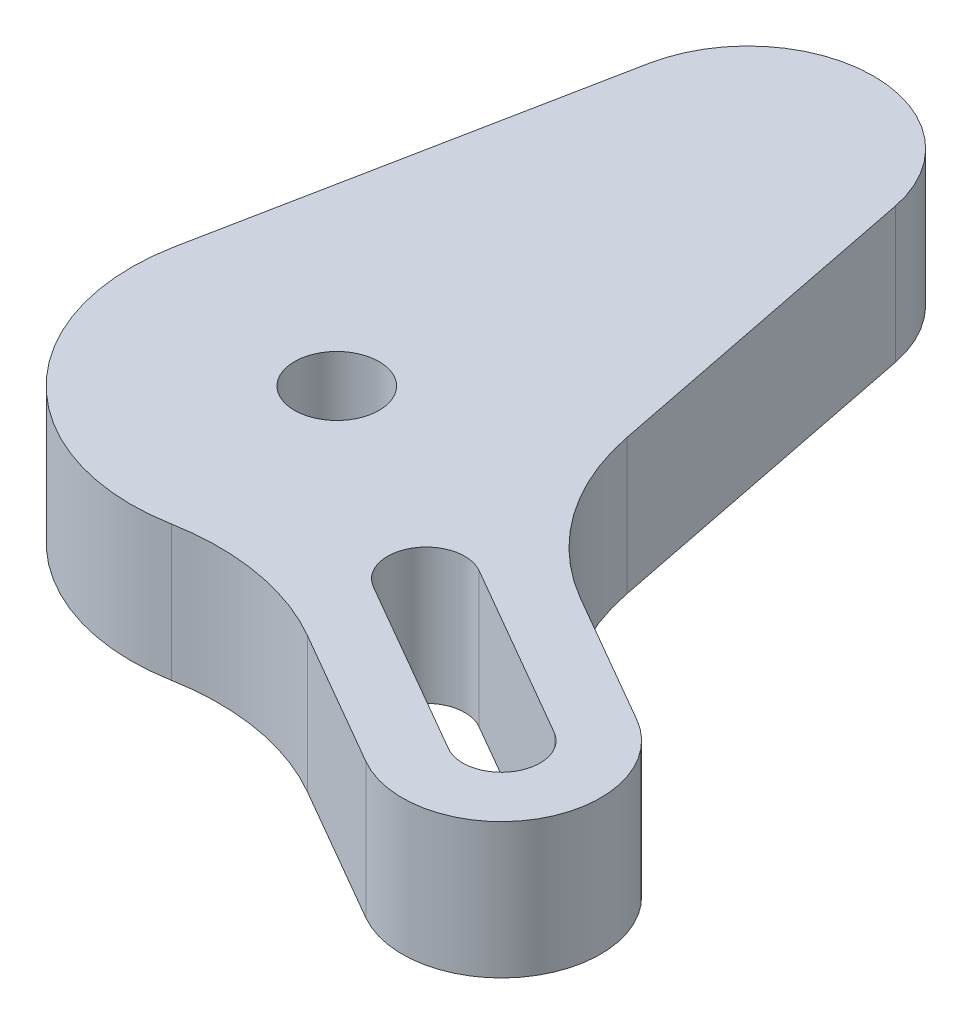
ISO-10303-21;
HEADER;
FILE_DESCRIPTION(('STEP AP214'),'2;1');
FILE_NAME('part.step','',(''),(''),'','','');
FILE_SCHEMA(('AUTOMOTIVE_DESIGN { 1 0 10303 214 1 1 1 1 }'));
ENDSEC;
DATA;
#1=APPLICATION_CONTEXT('core data for automotive mechanical design processes');
#2=APPLICATION_PROTOCOL_DEFINITION('international standard','automotive_design',2000,#1);
#3=PRODUCT_CONTEXT('',#1,'mechanical');
#4=PRODUCT('Part','Part','',(#3));
#5=PRODUCT_RELATED_PRODUCT_CATEGORY('part','',(#4));
#6=PRODUCT_DEFINITION_FORMATION('','',#4);
#7=PRODUCT_DEFINITION_CONTEXT('part definition',#1,'design');
#8=PRODUCT_DEFINITION('design','',#6,#7);
#9=PRODUCT_DEFINITION_SHAPE('','',#8);
#10=(LENGTH_UNIT() NAMED_UNIT(*) SI_UNIT(.MILLI.,.METRE.));
#11=(NAMED_UNIT(*) PLANE_ANGLE_UNIT() SI_UNIT($,.RADIAN.));
#12=(NAMED_UNIT(*) SI_UNIT($,.STERADIAN.) SOLID_ANGLE_UNIT());
#13=UNCERTAINTY_MEASURE_WITH_UNIT(LENGTH_MEASURE(1.E-05),#10,'distance_accuracy_value','');
#14=(GEOMETRIC_REPRESENTATION_CONTEXT(3) GLOBAL_UNCERTAINTY_ASSIGNED_CONTEXT((#13)) GLOBAL_UNIT_ASSIGNED_CONTEXT((#10,
#11,#12)) REPRESENTATION_CONTEXT('',''));
#15=CARTESIAN_POINT('',(0.,0.,0.));
#16=DIRECTION('',(0.,0.,1.));
#17=DIRECTION('',(1.,0.,0.));
#18=AXIS2_PLACEMENT_3D('',#15,#16,#17);
#19=CARTESIAN_POINT('',(0.,0.,-17.));
#20=DIRECTION('',(0.,1.,0.));
#21=DIRECTION('',(0.,0.,1.));
#22=AXIS2_PLACEMENT_3D('',#19,#20,#21);
#23=PLANE('',#22);
#24=CARTESIAN_POINT('',(0.,0.,0.));
#25=DIRECTION('',(0.,1.,0.));
#26=DIRECTION('',(0.,0.,1.));
#27=AXIS2_PLACEMENT_3D('',#24,#25,#26);
#28=CIRCLE('',#27,6.);
#29=CARTESIAN_POINT('',(-5.88586953708732,0.,-1.16470588235294));
#30=VERTEX_POINT('',#29);
#31=CARTESIAN_POINT('',(5.88586953708732,0.,-1.16470588235294));
#32=VERTEX_POINT('',#31);
#33=EDGE_CURVE('E292',#30,#32,#28,.T.);
#34=ORIENTED_EDGE('',*,*,#33,.T.);
#35=DIRECTION('',(0.194117647058824,0.,0.980978256181219));
#36=VECTOR('',#35,1.);
#37=CARTESIAN_POINT('',(5.88586953708732,0.,-1.16470588235294));
#38=LINE('',#37,#36);
#39=CARTESIAN_POINT('',(2.64864129168929,0.,-17.5241176470588));
#40=VERTEX_POINT('',#39);
#41=EDGE_CURVE('E279',#40,#32,#38,.T.);
#42=ORIENTED_EDGE('',*,*,#41,.F.);
#43=CARTESIAN_POINT('',(0.,0.,-17.));
#44=DIRECTION('',(0.,1.,0.));
#45=DIRECTION('',(0.,0.,1.));
#46=AXIS2_PLACEMENT_3D('',#43,#44,#45);
#47=CIRCLE('',#46,2.7);
#48=CARTESIAN_POINT('',(-2.64864129168929,0.,-17.5241176470588));
#49=VERTEX_POINT('',#48);
#50=EDGE_CURVE('E275',#40,#49,#47,.T.);
#51=ORIENTED_EDGE('',*,*,#50,.T.);
#52=DIRECTION('',(-0.194117647058824,0.,0.980978256181219));
#53=VECTOR('',#52,1.);
#54=CARTESIAN_POINT('',(-5.88586953708732,0.,-1.16470588235294));
#55=LINE('',#54,#53);
#56=EDGE_CURVE('E289',#49,#30,#55,.T.);
#57=ORIENTED_EDGE('',*,*,#56,.T.);
#58=EDGE_LOOP('',(#34,#42,#51,#57));
#59=FACE_BOUND('',#58,.T.);
#60=DIRECTION('',(0.194117647058824,0.,0.980978256181219));
#61=VECTOR('',#60,1.);
#62=CARTESIAN_POINT('',(8.33831517754037,0.,-1.65));
#63=LINE('',#62,#61);
#64=CARTESIAN_POINT('',(5.10108693214234,0.,-18.0094117647059));
#65=VERTEX_POINT('',#64);
#66=CARTESIAN_POINT('',(7.8440779192227,0.,-4.14764001959767));
#67=VERTEX_POINT('',#66);
#68=EDGE_CURVE('E314',#65,#67,#63,.T.);
#69=ORIENTED_EDGE('',*,*,#68,.T.);
#70=CARTESIAN_POINT('',(17.6538604810349,0.,-6.0888164901859));
#71=DIRECTION('',(0.,1.,0.));
#72=DIRECTION('',(0.,0.,1.));
#73=AXIS2_PLACEMENT_3D('',#70,#71,#72);
#74=CIRCLE('',#73,10.);
#75=CARTESIAN_POINT('',(12.6538604810349,0.,2.5714375476585));
#76=VERTEX_POINT('',#75);
#77=EDGE_CURVE('E89',#67,#76,#74,.T.);
#78=ORIENTED_EDGE('',*,*,#77,.T.);
#79=DIRECTION('',(-0.86602540378444,0.,-0.499999999999998));
#80=VECTOR('',#79,1.);
#81=CARTESIAN_POINT('',(18.1580725103906,0.,5.74929584448375));
#82=LINE('',#81,#80);
#83=CARTESIAN_POINT('',(18.1580725103906,0.,5.74929584448375));
#84=VERTEX_POINT('',#83);
#85=EDGE_CURVE('E248',#84,#76,#82,.T.);
#86=ORIENTED_EDGE('',*,*,#85,.F.);
#87=CARTESIAN_POINT('',(16.1080725103906,0.,9.29999999999995));
#88=DIRECTION('',(0.,1.,0.));
#89=DIRECTION('',(1.,0.,0.));
#90=AXIS2_PLACEMENT_3D('',#87,#88,#89);
#91=CIRCLE('',#90,4.1);
#92=CARTESIAN_POINT('',(14.0580725103906,0.,12.8507041555162));
#93=VERTEX_POINT('',#92);
#94=EDGE_CURVE('E245',#93,#84,#91,.T.);
#95=ORIENTED_EDGE('',*,*,#94,.F.);
#96=DIRECTION('',(-0.86602540378444,0.,-0.499999999999998));
#97=VECTOR('',#96,1.);
#98=CARTESIAN_POINT('',(14.0580725103906,0.,12.8507041555162));
#99=LINE('',#98,#97);
#100=CARTESIAN_POINT('',(8.32207790175145,0.,9.53902612414812));
#101=VERTEX_POINT('',#100);
#102=EDGE_CURVE('E251',#93,#101,#99,.T.);
#103=ORIENTED_EDGE('',*,*,#102,.T.);
#104=CARTESIAN_POINT('',(3.32207790175147,0.,18.1992801619925));
#105=DIRECTION('',(0.,1.,0.));
#106=DIRECTION('',(0.,0.,1.));
#107=AXIS2_PLACEMENT_3D('',#104,#105,#106);
#108=CIRCLE('',#107,10.);
#109=CARTESIAN_POINT('',(1.52636011702095,0.,8.36183142578035));
#110=VERTEX_POINT('',#109);
#111=EDGE_CURVE('E335',#101,#110,#108,.T.);
#112=ORIENTED_EDGE('',*,*,#111,.T.);
#113=CARTESIAN_POINT('',(0.,0.,0.));
#114=DIRECTION('',(0.,1.,0.));
#115=DIRECTION('',(1.,0.,0.));
#116=AXIS2_PLACEMENT_3D('',#113,#114,#115);
#117=CIRCLE('',#116,8.5);
#118=CARTESIAN_POINT('',(-8.33831517754037,0.,-1.65));
#119=VERTEX_POINT('',#118);
#120=EDGE_CURVE('E311',#119,#110,#117,.T.);
#121=ORIENTED_EDGE('',*,*,#120,.F.);
#122=DIRECTION('',(-0.194117647058824,0.,0.980978256181219));
#123=VECTOR('',#122,1.);
#124=CARTESIAN_POINT('',(-8.33831517754037,0.,-1.65));
#125=LINE('',#124,#123);
#126=CARTESIAN_POINT('',(-5.10108693214234,0.,-18.0094117647059));
#127=VERTEX_POINT('',#126);
#128=EDGE_CURVE('E309',#127,#119,#125,.T.);
#129=ORIENTED_EDGE('',*,*,#128,.F.);
#130=CARTESIAN_POINT('',(0.,0.,-17.));
#131=DIRECTION('',(0.,1.,0.));
#132=DIRECTION('',(1.,0.,0.));
#133=AXIS2_PLACEMENT_3D('',#130,#131,#132);
#134=CIRCLE('',#133,5.2);
#135=EDGE_CURVE('E306',#65,#127,#134,.T.);
#136=ORIENTED_EDGE('',*,*,#135,.F.);
#137=EDGE_LOOP('',(#69,#78,#86,#95,#103,#112,#121,#129,#136));
#138=FACE_BOUND('',#137,.T.);
#139=DIRECTION('',(-0.86602540378444,0.,-0.499999999999998));
#140=VECTOR('',#139,1.);
#141=CARTESIAN_POINT('',(16.9080725103906,0.,7.91435935394485));
#142=LINE('',#141,#140);
#143=CARTESIAN_POINT('',(16.9080725103906,0.,7.91435935394485));
#144=VERTEX_POINT('',#143);
#145=CARTESIAN_POINT('',(9.54685657822285,0.,3.66435935394487));
#146=VERTEX_POINT('',#145);
#147=EDGE_CURVE('E216',#144,#146,#142,.T.);
#148=ORIENTED_EDGE('',*,*,#147,.T.);
#149=CARTESIAN_POINT('',(8.74685657822285,0.,5.04999999999997));
#150=DIRECTION('',(0.,1.,0.));
#151=DIRECTION('',(0.,0.,1.));
#152=AXIS2_PLACEMENT_3D('',#149,#150,#151);
#153=CIRCLE('',#152,1.6);
#154=CARTESIAN_POINT('',(7.94685657822285,0.,6.43564064605508));
#155=VERTEX_POINT('',#154);
#156=EDGE_CURVE('E220',#146,#155,#153,.T.);
#157=ORIENTED_EDGE('',*,*,#156,.T.);
#158=DIRECTION('',(-0.86602540378444,0.,-0.499999999999998));
#159=VECTOR('',#158,1.);
#160=CARTESIAN_POINT('',(15.3080725103906,0.,10.6856406460551));
#161=LINE('',#160,#159);
#162=CARTESIAN_POINT('',(15.3080725103906,0.,10.6856406460551));
#163=VERTEX_POINT('',#162);
#164=EDGE_CURVE('E212',#163,#155,#161,.T.);
#165=ORIENTED_EDGE('',*,*,#164,.F.);
#166=CARTESIAN_POINT('',(16.1080725103906,0.,9.29999999999995));
#167=DIRECTION('',(0.,1.,0.));
#168=DIRECTION('',(0.,0.,1.));
#169=AXIS2_PLACEMENT_3D('',#166,#167,#168);
#170=CIRCLE('',#169,1.6);
#171=EDGE_CURVE('E204',#163,#144,#170,.T.);
#172=ORIENTED_EDGE('',*,*,#171,.T.);
#173=EDGE_LOOP('',(#148,#157,#165,#172));
#174=FACE_BOUND('',#173,.T.);
#175=ADVANCED_FACE('F81',(#59,#138,#174),#23,.F.);
#176=CARTESIAN_POINT('',(0.,2.6,-17.));
#177=DIRECTION('',(0.,-1.,0.));
#178=DIRECTION('',(0.,0.,-1.));
#179=AXIS2_PLACEMENT_3D('',#176,#177,#178);
#180=CYLINDRICAL_SURFACE('',#179,5.2);
#181=ORIENTED_EDGE('',*,*,#135,.T.);
#182=DIRECTION('',(0.,-1.,0.));
#183=VECTOR('',#182,1.);
#184=CARTESIAN_POINT('',(-5.10108693214234,2.6,-18.0094117647059));
#185=LINE('',#184,#183);
#186=CARTESIAN_POINT('',(-5.10108693214234,5.6,-18.0094117647059));
#187=VERTEX_POINT('',#186);
#188=EDGE_CURVE('E321',#187,#127,#185,.T.);
#189=ORIENTED_EDGE('',*,*,#188,.F.);
#190=CARTESIAN_POINT('',(0.,5.6,-17.));
#191=DIRECTION('',(0.,1.,0.));
#192=DIRECTION('',(0.,0.,1.));
#193=AXIS2_PLACEMENT_3D('',#190,#191,#192);
#194=CIRCLE('',#193,5.2);
#195=CARTESIAN_POINT('',(5.10108693214234,5.6,-18.0094117647059));
#196=VERTEX_POINT('',#195);
#197=EDGE_CURVE('E266',#196,#187,#194,.T.);
#198=ORIENTED_EDGE('',*,*,#197,.F.);
#199=DIRECTION('',(0.,-1.,0.));
#200=VECTOR('',#199,1.);
#201=CARTESIAN_POINT('',(5.10108693214234,2.6,-18.0094117647059));
#202=LINE('',#201,#200);
#203=EDGE_CURVE('E316',#196,#65,#202,.T.);
#204=ORIENTED_EDGE('',*,*,#203,.T.);
#205=EDGE_LOOP('',(#181,#189,#198,#204));
#206=FACE_BOUND('',#205,.T.);
#207=ADVANCED_FACE('F365',(#206),#180,.T.);
#208=CARTESIAN_POINT('',(-8.33831517754037,2.6,-1.65));
#209=DIRECTION('',(0.980978256181219,0.,0.194117647058824));
#210=DIRECTION('',(0.194117647058824,0.,-0.980978256181219));
#211=AXIS2_PLACEMENT_3D('',#208,#209,#210);
#212=PLANE('',#211);
#213=ORIENTED_EDGE('',*,*,#128,.T.);
#214=DIRECTION('',(0.,-1.,0.));
#215=VECTOR('',#214,1.);
#216=CARTESIAN_POINT('',(-8.33831517754037,2.6,-1.65));
#217=LINE('',#216,#215);
#218=CARTESIAN_POINT('',(-8.33831517754036,5.6,-1.65));
#219=VERTEX_POINT('',#218);
#220=EDGE_CURVE('E318',#219,#119,#217,.T.);
#221=ORIENTED_EDGE('',*,*,#220,.F.);
#222=DIRECTION('',(-0.194117647058824,0.,0.980978256181219));
#223=VECTOR('',#222,1.);
#224=CARTESIAN_POINT('',(-8.33831517754037,5.6,-1.65));
#225=LINE('',#224,#223);
#226=EDGE_CURVE('E269',#187,#219,#225,.T.);
#227=ORIENTED_EDGE('',*,*,#226,.F.);
#228=ORIENTED_EDGE('',*,*,#188,.T.);
#229=EDGE_LOOP('',(#213,#221,#227,#228));
#230=FACE_BOUND('',#229,.T.);
#231=ADVANCED_FACE('F369',(#230),#212,.F.);
#232=CARTESIAN_POINT('',(0.,2.6,0.));
#233=DIRECTION('',(0.,-1.,0.));
#234=DIRECTION('',(0.,0.,-1.));
#235=AXIS2_PLACEMENT_3D('',#232,#233,#234);
#236=CYLINDRICAL_SURFACE('',#235,8.5);
#237=ORIENTED_EDGE('',*,*,#120,.T.);
#238=DIRECTION('',(0.,-1.,0.));
#239=VECTOR('',#238,1.);
#240=CARTESIAN_POINT('',(1.52636011702095,2.6,8.36183142578035));
#241=LINE('',#240,#239);
#242=CARTESIAN_POINT('',(1.52636011702095,5.6,8.36183142578035));
#243=VERTEX_POINT('',#242);
#244=EDGE_CURVE('E324',#110,#243,#241,.F.);
#245=ORIENTED_EDGE('',*,*,#244,.T.);
#246=CARTESIAN_POINT('',(0.,5.6,0.));
#247=DIRECTION('',(0.,1.,0.));
#248=DIRECTION('',(0.,0.,1.));
#249=AXIS2_PLACEMENT_3D('',#246,#247,#248);
#250=CIRCLE('',#249,8.5);
#251=EDGE_CURVE('E272',#219,#243,#250,.T.);
#252=ORIENTED_EDGE('',*,*,#251,.F.);
#253=ORIENTED_EDGE('',*,*,#220,.T.);
#254=EDGE_LOOP('',(#237,#245,#252,#253));
#255=FACE_BOUND('',#254,.T.);
#256=ADVANCED_FACE('F344',(#255),#236,.T.);
#257=CARTESIAN_POINT('',(8.33831517754037,2.6,-1.65));
#258=DIRECTION('',(0.980978256181219,0.,-0.194117647058824));
#259=DIRECTION('',(-0.194117647058824,0.,-0.980978256181219));
#260=AXIS2_PLACEMENT_3D('',#257,#258,#259);
#261=PLANE('',#260);
#262=DIRECTION('',(-0.194117647058824,0.,-0.980978256181219));
#263=VECTOR('',#262,1.);
#264=CARTESIAN_POINT('',(8.33831517754037,5.6,-1.65));
#265=LINE('',#264,#263);
#266=CARTESIAN_POINT('',(7.8440779192227,5.6,-4.14764001959767));
#267=VERTEX_POINT('',#266);
#268=EDGE_CURVE('E263',#267,#196,#265,.T.);
#269=ORIENTED_EDGE('',*,*,#268,.F.);
#270=DIRECTION('',(0.,-1.,0.));
#271=VECTOR('',#270,1.);
#272=CARTESIAN_POINT('',(7.8440779192227,0.,-4.14764001959767));
#273=LINE('',#272,#271);
#274=EDGE_CURVE('E329',#267,#67,#273,.T.);
#275=ORIENTED_EDGE('',*,*,#274,.T.);
#276=ORIENTED_EDGE('',*,*,#68,.F.);
#277=ORIENTED_EDGE('',*,*,#203,.F.);
#278=EDGE_LOOP('',(#269,#275,#276,#277));
#279=FACE_BOUND('',#278,.T.);
#280=ADVANCED_FACE('F361',(#279),#261,.T.);
#281=CARTESIAN_POINT('',(0.,2.6,-17.));
#282=DIRECTION('',(0.,-1.,0.));
#283=DIRECTION('',(0.,0.,-1.));
#284=AXIS2_PLACEMENT_3D('',#281,#282,#283);
#285=CYLINDRICAL_SURFACE('',#284,2.7);
#286=ORIENTED_EDGE('',*,*,#50,.F.);
#287=DIRECTION('',(0.,-1.,0.));
#288=VECTOR('',#287,1.);
#289=CARTESIAN_POINT('',(2.64864129168929,2.6,-17.5241176470588));
#290=LINE('',#289,#288);
#291=CARTESIAN_POINT('',(2.64864129168929,2.6,-17.5241176470588));
#292=VERTEX_POINT('',#291);
#293=EDGE_CURVE('E286',#292,#40,#290,.T.);
#294=ORIENTED_EDGE('',*,*,#293,.F.);
#295=CARTESIAN_POINT('',(0.,2.6,-17.));
#296=DIRECTION('',(0.,1.,0.));
#297=DIRECTION('',(0.,0.,1.));
#298=AXIS2_PLACEMENT_3D('',#295,#296,#297);
#299=CIRCLE('',#298,2.7);
#300=CARTESIAN_POINT('',(-2.64864129168929,2.6,-17.5241176470588));
#301=VERTEX_POINT('',#300);
#302=EDGE_CURVE('E276',#292,#301,#299,.T.);
#303=ORIENTED_EDGE('',*,*,#302,.T.);
#304=DIRECTION('',(0.,-1.,0.));
#305=VECTOR('',#304,1.);
#306=CARTESIAN_POINT('',(-2.64864129168929,2.6,-17.5241176470588));
#307=LINE('',#306,#305);
#308=EDGE_CURVE('E303',#301,#49,#307,.T.);
#309=ORIENTED_EDGE('',*,*,#308,.T.);
#310=EDGE_LOOP('',(#286,#294,#303,#309));
#311=FACE_BOUND('',#310,.T.);
#312=ADVANCED_FACE('F385',(#311),#285,.F.);
#313=CARTESIAN_POINT('',(-5.88586953708732,2.6,-1.16470588235294));
#314=DIRECTION('',(0.980978256181219,0.,0.194117647058824));
#315=DIRECTION('',(0.194117647058824,0.,-0.980978256181219));
#316=AXIS2_PLACEMENT_3D('',#313,#314,#315);
#317=PLANE('',#316);
#318=ORIENTED_EDGE('',*,*,#56,.F.);
#319=ORIENTED_EDGE('',*,*,#308,.F.);
#320=DIRECTION('',(-0.194117647058824,0.,0.980978256181219));
#321=VECTOR('',#320,1.);
#322=CARTESIAN_POINT('',(-5.88586953708732,2.6,-1.16470588235294));
#323=LINE('',#322,#321);
#324=CARTESIAN_POINT('',(-5.88586953708732,2.6,-1.16470588235294));
#325=VERTEX_POINT('',#324);
#326=EDGE_CURVE('E278',#301,#325,#323,.T.);
#327=ORIENTED_EDGE('',*,*,#326,.T.);
#328=DIRECTION('',(0.,-1.,0.));
#329=VECTOR('',#328,1.);
#330=CARTESIAN_POINT('',(-5.88586953708732,2.6,-1.16470588235294));
#331=LINE('',#330,#329);
#332=EDGE_CURVE('E301',#325,#30,#331,.T.);
#333=ORIENTED_EDGE('',*,*,#332,.T.);
#334=EDGE_LOOP('',(#318,#319,#327,#333));
#335=FACE_BOUND('',#334,.T.);
#336=ADVANCED_FACE('F391',(#335),#317,.T.);
#337=CARTESIAN_POINT('',(0.,2.6,0.));
#338=DIRECTION('',(0.,-1.,0.));
#339=DIRECTION('',(0.,0.,-1.));
#340=AXIS2_PLACEMENT_3D('',#337,#338,#339);
#341=CYLINDRICAL_SURFACE('',#340,6.);
#342=CARTESIAN_POINT('',(0.,2.6,0.));
#343=DIRECTION('',(0.,1.,0.));
#344=DIRECTION('',(0.,0.,1.));
#345=AXIS2_PLACEMENT_3D('',#342,#343,#344);
#346=CIRCLE('',#345,6.);
#347=CARTESIAN_POINT('',(5.88586953708732,2.6,-1.16470588235294));
#348=VERTEX_POINT('',#347);
#349=EDGE_CURVE('E281',#325,#348,#346,.T.);
#350=ORIENTED_EDGE('',*,*,#349,.T.);
#351=DIRECTION('',(0.,-1.,0.));
#352=VECTOR('',#351,1.);
#353=CARTESIAN_POINT('',(5.88586953708732,2.6,-1.16470588235294));
#354=LINE('',#353,#352);
#355=EDGE_CURVE('E298',#348,#32,#354,.T.);
#356=ORIENTED_EDGE('',*,*,#355,.T.);
#357=ORIENTED_EDGE('',*,*,#33,.F.);
#358=ORIENTED_EDGE('',*,*,#332,.F.);
#359=EDGE_LOOP('',(#350,#356,#357,#358));
#360=FACE_BOUND('',#359,.T.);
#361=ADVANCED_FACE('F396',(#360),#341,.F.);
#362=CARTESIAN_POINT('',(5.88586953708732,2.6,-1.16470588235294));
#363=DIRECTION('',(0.980978256181219,0.,-0.194117647058824));
#364=DIRECTION('',(-0.194117647058824,0.,-0.980978256181219));
#365=AXIS2_PLACEMENT_3D('',#362,#363,#364);
#366=PLANE('',#365);
#367=ORIENTED_EDGE('',*,*,#41,.T.);
#368=ORIENTED_EDGE('',*,*,#355,.F.);
#369=DIRECTION('',(0.194117647058824,0.,0.980978256181219));
#370=VECTOR('',#369,1.);
#371=CARTESIAN_POINT('',(5.88586953708732,2.6,-1.16470588235294));
#372=LINE('',#371,#370);
#373=EDGE_CURVE('E283',#292,#348,#372,.T.);
#374=ORIENTED_EDGE('',*,*,#373,.F.);
#375=ORIENTED_EDGE('',*,*,#293,.T.);
#376=EDGE_LOOP('',(#367,#368,#374,#375));
#377=FACE_BOUND('',#376,.T.);
#378=ADVANCED_FACE('F402',(#377),#366,.F.);
#379=CARTESIAN_POINT('',(0.,2.6,0.));
#380=DIRECTION('',(0.,1.,0.));
#381=DIRECTION('',(0.,0.,1.));
#382=AXIS2_PLACEMENT_3D('',#379,#380,#381);
#383=PLANE('',#382);
#384=CARTESIAN_POINT('',(0.,2.6,0.));
#385=DIRECTION('',(0.,1.,0.));
#386=DIRECTION('',(0.,0.,1.));
#387=AXIS2_PLACEMENT_3D('',#384,#385,#386);
#388=CIRCLE('',#387,1.75);
#389=CARTESIAN_POINT('',(0.,2.6,1.75));
#390=VERTEX_POINT('',#389);
#391=EDGE_CURVE('E229',#390,#390,#388,.T.);
#392=ORIENTED_EDGE('',*,*,#391,.T.);
#393=EDGE_LOOP('',(#392));
#394=FACE_BOUND('',#393,.T.);
#395=ORIENTED_EDGE('',*,*,#302,.F.);
#396=ORIENTED_EDGE('',*,*,#373,.T.);
#397=ORIENTED_EDGE('',*,*,#349,.F.);
#398=ORIENTED_EDGE('',*,*,#326,.F.);
#399=EDGE_LOOP('',(#395,#396,#397,#398));
#400=FACE_BOUND('',#399,.T.);
#401=ADVANCED_FACE('F410',(#394,#400),#383,.F.);
#402=CARTESIAN_POINT('',(0.,5.6,0.));
#403=DIRECTION('',(0.,1.,0.));
#404=DIRECTION('',(0.,0.,1.));
#405=AXIS2_PLACEMENT_3D('',#402,#403,#404);
#406=PLANE('',#405);
#407=CARTESIAN_POINT('',(0.,5.6,0.));
#408=DIRECTION('',(0.,1.,0.));
#409=DIRECTION('',(0.,0.,1.));
#410=AXIS2_PLACEMENT_3D('',#407,#408,#409);
#411=CIRCLE('',#410,1.75);
#412=CARTESIAN_POINT('',(0.,5.6,1.75));
#413=VERTEX_POINT('',#412);
#414=EDGE_CURVE('E612',#413,#413,#411,.T.);
#415=ORIENTED_EDGE('',*,*,#414,.F.);
#416=EDGE_LOOP('',(#415));
#417=FACE_BOUND('',#416,.T.);
#418=CARTESIAN_POINT('',(8.74685657822285,5.6,5.04999999999997));
#419=DIRECTION('',(0.,1.,0.));
#420=DIRECTION('',(0.,0.,1.));
#421=AXIS2_PLACEMENT_3D('',#418,#419,#420);
#422=CIRCLE('',#421,1.6);
#423=CARTESIAN_POINT('',(9.54685657822285,5.6,3.66435935394487));
#424=VERTEX_POINT('',#423);
#425=CARTESIAN_POINT('',(7.94685657822285,5.6,6.43564064605508));
#426=VERTEX_POINT('',#425);
#427=EDGE_CURVE('E226',#424,#426,#422,.T.);
#428=ORIENTED_EDGE('',*,*,#427,.F.);
#429=DIRECTION('',(-0.86602540378444,0.,-0.499999999999998));
#430=VECTOR('',#429,1.);
#431=CARTESIAN_POINT('',(16.9080725103906,5.6,7.91435935394485));
#432=LINE('',#431,#430);
#433=CARTESIAN_POINT('',(16.9080725103906,5.6,7.91435935394485));
#434=VERTEX_POINT('',#433);
#435=EDGE_CURVE('E235',#434,#424,#432,.T.);
#436=ORIENTED_EDGE('',*,*,#435,.F.);
#437=CARTESIAN_POINT('',(16.1080725103906,5.6,9.29999999999995));
#438=DIRECTION('',(0.,1.,0.));
#439=DIRECTION('',(0.,0.,1.));
#440=AXIS2_PLACEMENT_3D('',#437,#438,#439);
#441=CIRCLE('',#440,1.6);
#442=CARTESIAN_POINT('',(15.3080725103906,5.6,10.6856406460551));
#443=VERTEX_POINT('',#442);
#444=EDGE_CURVE('E207',#443,#434,#441,.T.);
#445=ORIENTED_EDGE('',*,*,#444,.F.);
#446=DIRECTION('',(-0.86602540378444,0.,-0.499999999999998));
#447=VECTOR('',#446,1.);
#448=CARTESIAN_POINT('',(15.3080725103906,5.6,10.6856406460551));
#449=LINE('',#448,#447);
#450=EDGE_CURVE('E223',#443,#426,#449,.T.);
#451=ORIENTED_EDGE('',*,*,#450,.T.);
#452=EDGE_LOOP('',(#428,#436,#445,#451));
#453=FACE_BOUND('',#452,.T.);
#454=ORIENTED_EDGE('',*,*,#251,.T.);
#455=CARTESIAN_POINT('',(3.32207790175147,5.6,18.1992801619925));
#456=DIRECTION('',(0.,1.,0.));
#457=DIRECTION('',(0.,0.,1.));
#458=AXIS2_PLACEMENT_3D('',#455,#456,#457);
#459=CIRCLE('',#458,10.);
#460=CARTESIAN_POINT('',(8.32207790175145,5.6,9.53902612414812));
#461=VERTEX_POINT('',#460);
#462=EDGE_CURVE('E333',#243,#461,#459,.F.);
#463=ORIENTED_EDGE('',*,*,#462,.T.);
#464=DIRECTION('',(-0.86602540378444,0.,-0.499999999999998));
#465=VECTOR('',#464,1.);
#466=CARTESIAN_POINT('',(14.0580725103906,5.6,12.8507041555162));
#467=LINE('',#466,#465);
#468=CARTESIAN_POINT('',(14.0580725103906,5.6,12.8507041555162));
#469=VERTEX_POINT('',#468);
#470=EDGE_CURVE('E249',#469,#461,#467,.T.);
#471=ORIENTED_EDGE('',*,*,#470,.F.);
#472=CARTESIAN_POINT('',(16.1080725103906,5.6,9.29999999999995));
#473=DIRECTION('',(0.,1.,0.));
#474=DIRECTION('',(1.,0.,0.));
#475=AXIS2_PLACEMENT_3D('',#472,#473,#474);
#476=CIRCLE('',#475,4.1);
#477=CARTESIAN_POINT('',(18.1580725103906,5.6,5.74929584448375));
#478=VERTEX_POINT('',#477);
#479=EDGE_CURVE('E240',#469,#478,#476,.T.);
#480=ORIENTED_EDGE('',*,*,#479,.T.);
#481=DIRECTION('',(-0.86602540378444,0.,-0.499999999999998));
#482=VECTOR('',#481,1.);
#483=CARTESIAN_POINT('',(18.1580725103906,5.6,5.74929584448375));
#484=LINE('',#483,#482);
#485=CARTESIAN_POINT('',(12.6538604810349,5.6,2.5714375476585));
#486=VERTEX_POINT('',#485);
#487=EDGE_CURVE('E257',#478,#486,#484,.T.);
#488=ORIENTED_EDGE('',*,*,#487,.T.);
#489=CARTESIAN_POINT('',(17.6538604810349,5.6,-6.0888164901859));
#490=DIRECTION('',(0.,1.,0.));
#491=DIRECTION('',(0.,0.,1.));
#492=AXIS2_PLACEMENT_3D('',#489,#490,#491);
#493=CIRCLE('',#492,10.);
#494=EDGE_CURVE('E12',#486,#267,#493,.F.);
#495=ORIENTED_EDGE('',*,*,#494,.T.);
#496=ORIENTED_EDGE('',*,*,#268,.T.);
#497=ORIENTED_EDGE('',*,*,#197,.T.);
#498=ORIENTED_EDGE('',*,*,#226,.T.);
#499=EDGE_LOOP('',(#454,#463,#471,#480,#488,#495,#496,#497,#498));
#500=FACE_BOUND('',#499,.T.);
#501=ADVANCED_FACE('F349',(#417,#453,#500),#406,.T.);
#502=CARTESIAN_POINT('',(8.74685657822285,0.,5.04999999999997));
#503=DIRECTION('',(0.,1.,0.));
#504=DIRECTION('',(0.,0.,1.));
#505=AXIS2_PLACEMENT_3D('',#502,#503,#504);
#506=CYLINDRICAL_SURFACE('',#505,1.6);
#507=ORIENTED_EDGE('',*,*,#156,.F.);
#508=DIRECTION('',(0.,1.,0.));
#509=VECTOR('',#508,1.);
#510=CARTESIAN_POINT('',(9.54685657822285,0.,3.66435935394487));
#511=LINE('',#510,#509);
#512=EDGE_CURVE('E211',#146,#424,#511,.T.);
#513=ORIENTED_EDGE('',*,*,#512,.T.);
#514=ORIENTED_EDGE('',*,*,#427,.T.);
#515=DIRECTION('',(0.,1.,0.));
#516=VECTOR('',#515,1.);
#517=CARTESIAN_POINT('',(7.94685657822285,0.,6.43564064605508));
#518=LINE('',#517,#516);
#519=EDGE_CURVE('E241',#155,#426,#518,.T.);
#520=ORIENTED_EDGE('',*,*,#519,.F.);
#521=EDGE_LOOP('',(#507,#513,#514,#520));
#522=FACE_BOUND('',#521,.T.);
#523=ADVANCED_FACE('F419',(#522),#506,.F.);
#524=CARTESIAN_POINT('',(16.1080725103906,0.,9.29999999999995));
#525=DIRECTION('',(0.,1.,0.));
#526=DIRECTION('',(0.,0.,1.));
#527=AXIS2_PLACEMENT_3D('',#524,#525,#526);
#528=CYLINDRICAL_SURFACE('',#527,4.1);
#529=ORIENTED_EDGE('',*,*,#479,.F.);
#530=DIRECTION('',(0.,1.,0.));
#531=VECTOR('',#530,1.);
#532=CARTESIAN_POINT('',(14.0580725103906,0.,12.8507041555162));
#533=LINE('',#532,#531);
#534=EDGE_CURVE('E261',#93,#469,#533,.T.);
#535=ORIENTED_EDGE('',*,*,#534,.F.);
#536=ORIENTED_EDGE('',*,*,#94,.T.);
#537=DIRECTION('',(0.,1.,0.));
#538=VECTOR('',#537,1.);
#539=CARTESIAN_POINT('',(18.1580725103906,0.,5.74929584448375));
#540=LINE('',#539,#538);
#541=EDGE_CURVE('E254',#84,#478,#540,.T.);
#542=ORIENTED_EDGE('',*,*,#541,.T.);
#543=EDGE_LOOP('',(#529,#535,#536,#542));
#544=FACE_BOUND('',#543,.T.);
#545=ADVANCED_FACE('F354',(#544),#528,.T.);
#546=CARTESIAN_POINT('',(14.0580725103906,0.,12.8507041555162));
#547=DIRECTION('',(0.499999999999998,0.,-0.86602540378444));
#548=DIRECTION('',(-0.86602540378444,0.,-0.499999999999998));
#549=AXIS2_PLACEMENT_3D('',#546,#547,#548);
#550=PLANE('',#549);
#551=ORIENTED_EDGE('',*,*,#470,.T.);
#552=DIRECTION('',(0.,1.,0.));
#553=VECTOR('',#552,1.);
#554=CARTESIAN_POINT('',(8.32207790175145,0.,9.53902612414812));
#555=LINE('',#554,#553);
#556=EDGE_CURVE('E327',#461,#101,#555,.F.);
#557=ORIENTED_EDGE('',*,*,#556,.T.);
#558=ORIENTED_EDGE('',*,*,#102,.F.);
#559=ORIENTED_EDGE('',*,*,#534,.T.);
#560=EDGE_LOOP('',(#551,#557,#558,#559));
#561=FACE_BOUND('',#560,.T.);
#562=ADVANCED_FACE('F352',(#561),#550,.F.);
#563=CARTESIAN_POINT('',(18.1580725103906,0.,5.74929584448375));
#564=DIRECTION('',(0.499999999999998,0.,-0.86602540378444));
#565=DIRECTION('',(-0.86602540378444,0.,-0.499999999999998));
#566=AXIS2_PLACEMENT_3D('',#563,#564,#565);
#567=PLANE('',#566);
#568=ORIENTED_EDGE('',*,*,#85,.T.);
#569=DIRECTION('',(0.,-1.,0.));
#570=VECTOR('',#569,1.);
#571=CARTESIAN_POINT('',(12.6538604810349,5.6,2.5714375476585));
#572=LINE('',#571,#570);
#573=EDGE_CURVE('E102',#76,#486,#572,.F.);
#574=ORIENTED_EDGE('',*,*,#573,.T.);
#575=ORIENTED_EDGE('',*,*,#487,.F.);
#576=ORIENTED_EDGE('',*,*,#541,.F.);
#577=EDGE_LOOP('',(#568,#574,#575,#576));
#578=FACE_BOUND('',#577,.T.);
#579=ADVANCED_FACE('F514',(#578),#567,.T.);
#580=CARTESIAN_POINT('',(16.1080725103906,0.,9.29999999999995));
#581=DIRECTION('',(0.,1.,0.));
#582=DIRECTION('',(0.,0.,1.));
#583=AXIS2_PLACEMENT_3D('',#580,#581,#582);
#584=CYLINDRICAL_SURFACE('',#583,1.6);
#585=ORIENTED_EDGE('',*,*,#444,.T.);
#586=DIRECTION('',(0.,1.,0.));
#587=VECTOR('',#586,1.);
#588=CARTESIAN_POINT('',(16.9080725103906,0.,7.91435935394485));
#589=LINE('',#588,#587);
#590=EDGE_CURVE('E200',#144,#434,#589,.T.);
#591=ORIENTED_EDGE('',*,*,#590,.F.);
#592=ORIENTED_EDGE('',*,*,#171,.F.);
#593=DIRECTION('',(0.,1.,0.));
#594=VECTOR('',#593,1.);
#595=CARTESIAN_POINT('',(15.3080725103906,0.,10.6856406460551));
#596=LINE('',#595,#594);
#597=EDGE_CURVE('E238',#163,#443,#596,.T.);
#598=ORIENTED_EDGE('',*,*,#597,.T.);
#599=EDGE_LOOP('',(#585,#591,#592,#598));
#600=FACE_BOUND('',#599,.T.);
#601=ADVANCED_FACE('F202',(#600),#584,.F.);
#602=CARTESIAN_POINT('',(15.3080725103906,0.,10.6856406460551));
#603=DIRECTION('',(0.499999999999998,0.,-0.86602540378444));
#604=DIRECTION('',(-0.86602540378444,0.,-0.499999999999998));
#605=AXIS2_PLACEMENT_3D('',#602,#603,#604);
#606=PLANE('',#605);
#607=ORIENTED_EDGE('',*,*,#450,.F.);
#608=ORIENTED_EDGE('',*,*,#597,.F.);
#609=ORIENTED_EDGE('',*,*,#164,.T.);
#610=ORIENTED_EDGE('',*,*,#519,.T.);
#611=EDGE_LOOP('',(#607,#608,#609,#610));
#612=FACE_BOUND('',#611,.T.);
#613=ADVANCED_FACE('F555',(#612),#606,.T.);
#614=CARTESIAN_POINT('',(16.9080725103906,0.,7.91435935394485));
#615=DIRECTION('',(0.499999999999998,0.,-0.86602540378444));
#616=DIRECTION('',(-0.86602540378444,0.,-0.499999999999998));
#617=AXIS2_PLACEMENT_3D('',#614,#615,#616);
#618=PLANE('',#617);
#619=ORIENTED_EDGE('',*,*,#435,.T.);
#620=ORIENTED_EDGE('',*,*,#512,.F.);
#621=ORIENTED_EDGE('',*,*,#147,.F.);
#622=ORIENTED_EDGE('',*,*,#590,.T.);
#623=EDGE_LOOP('',(#619,#620,#621,#622));
#624=FACE_BOUND('',#623,.T.);
#625=ADVANCED_FACE('F217',(#624),#618,.F.);
#626=CARTESIAN_POINT('',(0.,0.,0.));
#627=DIRECTION('',(0.,1.,0.));
#628=DIRECTION('',(0.,0.,1.));
#629=AXIS2_PLACEMENT_3D('',#626,#627,#628);
#630=CYLINDRICAL_SURFACE('',#629,1.75);
#631=ORIENTED_EDGE('',*,*,#414,.T.);
#632=EDGE_LOOP('',(#631));
#633=FACE_BOUND('',#632,.T.);
#634=ORIENTED_EDGE('',*,*,#391,.F.);
#635=EDGE_LOOP('',(#634));
#636=FACE_BOUND('',#635,.T.);
#637=ADVANCED_FACE('F535',(#633,#636),#630,.F.);
#638=CARTESIAN_POINT('',(3.32207790175147,2.6,18.1992801619925));
#639=DIRECTION('',(0.,-1.,0.));
#640=DIRECTION('',(0.,0.,-1.));
#641=AXIS2_PLACEMENT_3D('',#638,#639,#640);
#642=CYLINDRICAL_SURFACE('',#641,10.);
#643=ORIENTED_EDGE('',*,*,#111,.F.);
#644=ORIENTED_EDGE('',*,*,#556,.F.);
#645=ORIENTED_EDGE('',*,*,#462,.F.);
#646=ORIENTED_EDGE('',*,*,#244,.F.);
#647=EDGE_LOOP('',(#643,#644,#645,#646));
#648=FACE_BOUND('',#647,.T.);
#649=ADVANCED_FACE('F346',(#648),#642,.F.);
#650=CARTESIAN_POINT('',(17.6538604810349,2.6,-6.0888164901859));
#651=DIRECTION('',(0.,1.,0.));
#652=DIRECTION('',(0.,0.,1.));
#653=AXIS2_PLACEMENT_3D('',#650,#651,#652);
#654=CYLINDRICAL_SURFACE('',#653,10.);
#655=ORIENTED_EDGE('',*,*,#494,.F.);
#656=ORIENTED_EDGE('',*,*,#573,.F.);
#657=ORIENTED_EDGE('',*,*,#77,.F.);
#658=ORIENTED_EDGE('',*,*,#274,.F.);
#659=EDGE_LOOP('',(#655,#656,#657,#658));
#660=FACE_BOUND('',#659,.T.);
#661=ADVANCED_FACE('F83',(#660),#654,.F.);
#662=CLOSED_SHELL('',(#175,#207,#231,#256,#280,#312,#336,#361,#378,#401,#501,#523,#545,#562,
#579,#601,#613,#625,#637,#649,#661));
#663=MANIFOLD_SOLID_BREP('B2',#662);
#664=ADVANCED_BREP_SHAPE_REPRESENTATION('',(#18,#663),#14);
#665=SHAPE_DEFINITION_REPRESENTATION(#9,#664);
ENDSEC;
END-ISO-10303-21;
